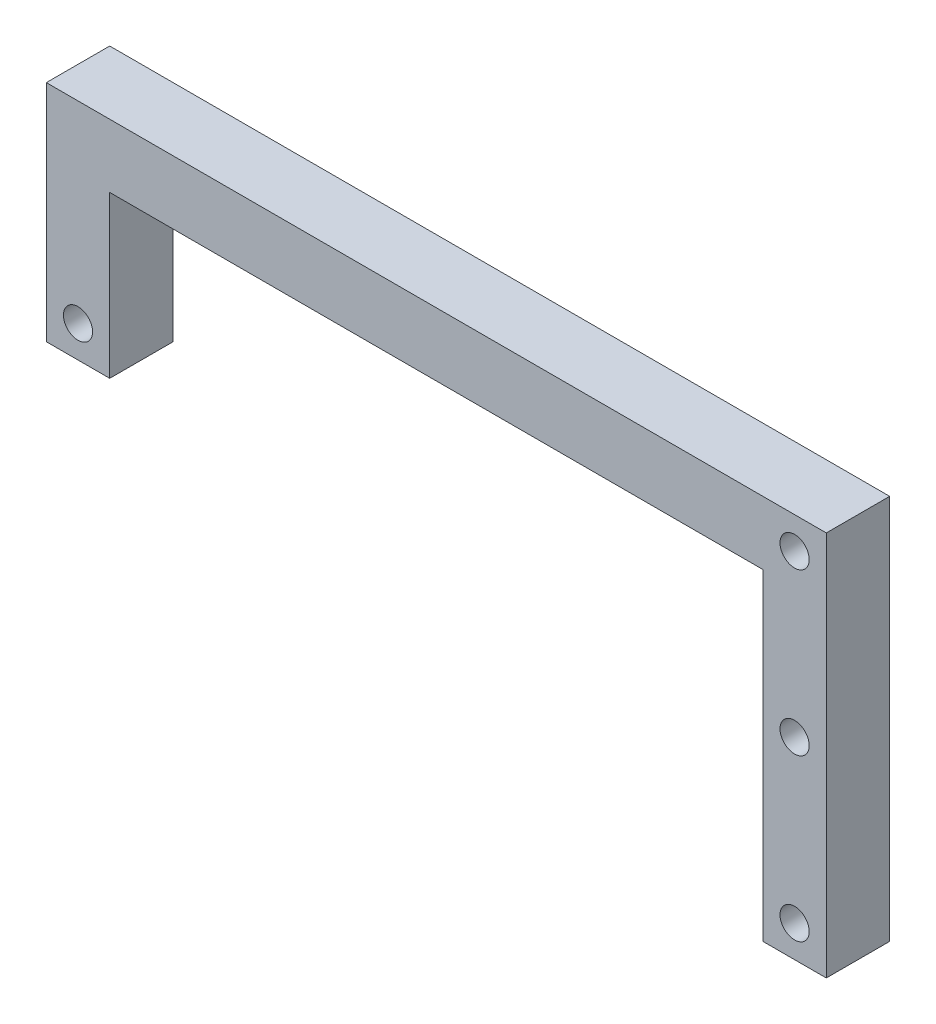
ISO-10303-21;
HEADER;
FILE_DESCRIPTION(('STEP AP214'),'2;1');
FILE_NAME('part.step','',(''),(''),'','','');
FILE_SCHEMA(('AUTOMOTIVE_DESIGN { 1 0 10303 214 1 1 1 1 }'));
ENDSEC;
DATA;
#1=APPLICATION_CONTEXT('core data for automotive mechanical design processes');
#2=APPLICATION_PROTOCOL_DEFINITION('international standard','automotive_design',2000,#1);
#3=PRODUCT_CONTEXT('',#1,'mechanical');
#4=PRODUCT('Part','Part','',(#3));
#5=PRODUCT_RELATED_PRODUCT_CATEGORY('part','',(#4));
#6=PRODUCT_DEFINITION_FORMATION('','',#4);
#7=PRODUCT_DEFINITION_CONTEXT('part definition',#1,'design');
#8=PRODUCT_DEFINITION('design','',#6,#7);
#9=PRODUCT_DEFINITION_SHAPE('','',#8);
#10=(LENGTH_UNIT() NAMED_UNIT(*) SI_UNIT(.MILLI.,.METRE.));
#11=(NAMED_UNIT(*) PLANE_ANGLE_UNIT() SI_UNIT($,.RADIAN.));
#12=(NAMED_UNIT(*) SI_UNIT($,.STERADIAN.) SOLID_ANGLE_UNIT());
#13=UNCERTAINTY_MEASURE_WITH_UNIT(LENGTH_MEASURE(1.E-05),#10,'distance_accuracy_value','');
#14=(GEOMETRIC_REPRESENTATION_CONTEXT(3) GLOBAL_UNCERTAINTY_ASSIGNED_CONTEXT((#13)) GLOBAL_UNIT_ASSIGNED_CONTEXT((#10,
#11,#12)) REPRESENTATION_CONTEXT('',''));
#15=CARTESIAN_POINT('',(0.,0.,0.));
#16=DIRECTION('',(0.,0.,1.));
#17=DIRECTION('',(1.,0.,0.));
#18=AXIS2_PLACEMENT_3D('',#15,#16,#17);
#19=CARTESIAN_POINT('',(0.,0.,10.));
#20=DIRECTION('',(0.,0.,1.));
#21=DIRECTION('',(1.,0.,0.));
#22=AXIS2_PLACEMENT_3D('',#19,#20,#21);
#23=PLANE('',#22);
#24=CARTESIAN_POINT('',(113.03,-25.4,10.));
#25=DIRECTION('',(0.,0.,1.));
#26=DIRECTION('',(1.,0.,0.));
#27=AXIS2_PLACEMENT_3D('',#24,#25,#26);
#28=CIRCLE('',#27,2.29999999999999);
#29=CARTESIAN_POINT('',(115.33,-25.4,10.));
#30=VERTEX_POINT('',#29);
#31=EDGE_CURVE('E221',#30,#30,#28,.T.);
#32=ORIENTED_EDGE('',*,*,#31,.F.);
#33=EDGE_LOOP('',(#32));
#34=FACE_BOUND('',#33,.T.);
#35=CARTESIAN_POINT('',(0.,0.,10.));
#36=DIRECTION('',(0.,0.,1.));
#37=DIRECTION('',(1.,0.,0.));
#38=AXIS2_PLACEMENT_3D('',#35,#36,#37);
#39=CIRCLE('',#38,2.3);
#40=CARTESIAN_POINT('',(2.3,0.,10.));
#41=VERTEX_POINT('',#40);
#42=EDGE_CURVE('E146',#41,#41,#39,.T.);
#43=ORIENTED_EDGE('',*,*,#42,.F.);
#44=EDGE_LOOP('',(#43));
#45=FACE_BOUND('',#44,.T.);
#46=DIRECTION('',(0.,-1.,0.));
#47=VECTOR('',#46,1.);
#48=CARTESIAN_POINT('',(108.03,20.4,10.));
#49=LINE('',#48,#47);
#50=CARTESIAN_POINT('',(108.03,20.4,10.));
#51=VERTEX_POINT('',#50);
#52=CARTESIAN_POINT('',(108.03,-30.4,10.));
#53=VERTEX_POINT('',#52);
#54=EDGE_CURVE('E164',#51,#53,#49,.T.);
#55=ORIENTED_EDGE('',*,*,#54,.T.);
#56=DIRECTION('',(1.,0.,0.));
#57=VECTOR('',#56,1.);
#58=CARTESIAN_POINT('',(108.03,-30.4,10.));
#59=LINE('',#58,#57);
#60=CARTESIAN_POINT('',(118.03,-30.4,10.));
#61=VERTEX_POINT('',#60);
#62=EDGE_CURVE('E100',#53,#61,#59,.T.);
#63=ORIENTED_EDGE('',*,*,#62,.T.);
#64=DIRECTION('',(0.,1.,0.));
#65=VECTOR('',#64,1.);
#66=CARTESIAN_POINT('',(118.03,-30.4,10.));
#67=LINE('',#66,#65);
#68=CARTESIAN_POINT('',(118.03,30.4,10.));
#69=VERTEX_POINT('',#68);
#70=EDGE_CURVE('E185',#61,#69,#67,.T.);
#71=ORIENTED_EDGE('',*,*,#70,.T.);
#72=DIRECTION('',(-1.,0.,0.));
#73=VECTOR('',#72,1.);
#74=CARTESIAN_POINT('',(118.03,30.4,10.));
#75=LINE('',#74,#73);
#76=CARTESIAN_POINT('',(-5.00000000000001,30.4,10.));
#77=VERTEX_POINT('',#76);
#78=EDGE_CURVE('E199',#69,#77,#75,.T.);
#79=ORIENTED_EDGE('',*,*,#78,.T.);
#80=DIRECTION('',(0.,-1.,0.));
#81=VECTOR('',#80,1.);
#82=CARTESIAN_POINT('',(-5.00000000000001,30.4,10.));
#83=LINE('',#82,#81);
#84=CARTESIAN_POINT('',(-5.,-5.,10.));
#85=VERTEX_POINT('',#84);
#86=EDGE_CURVE('E119',#77,#85,#83,.T.);
#87=ORIENTED_EDGE('',*,*,#86,.T.);
#88=DIRECTION('',(1.,0.,0.));
#89=VECTOR('',#88,1.);
#90=CARTESIAN_POINT('',(-5.,-5.,10.));
#91=LINE('',#90,#89);
#92=CARTESIAN_POINT('',(5.,-5.,10.));
#93=VERTEX_POINT('',#92);
#94=EDGE_CURVE('E113',#85,#93,#91,.T.);
#95=ORIENTED_EDGE('',*,*,#94,.T.);
#96=DIRECTION('',(0.,1.,0.));
#97=VECTOR('',#96,1.);
#98=CARTESIAN_POINT('',(5.,-5.,10.));
#99=LINE('',#98,#97);
#100=CARTESIAN_POINT('',(5.,20.4,10.));
#101=VERTEX_POINT('',#100);
#102=EDGE_CURVE('E117',#93,#101,#99,.T.);
#103=ORIENTED_EDGE('',*,*,#102,.T.);
#104=DIRECTION('',(1.,0.,0.));
#105=VECTOR('',#104,1.);
#106=CARTESIAN_POINT('',(5.,20.4,10.));
#107=LINE('',#106,#105);
#108=EDGE_CURVE('E57',#101,#51,#107,.T.);
#109=ORIENTED_EDGE('',*,*,#108,.T.);
#110=EDGE_LOOP('',(#55,#63,#71,#79,#87,#95,#103,#109));
#111=FACE_BOUND('',#110,.T.);
#112=CARTESIAN_POINT('',(113.03,0.,10.));
#113=DIRECTION('',(0.,0.,1.));
#114=DIRECTION('',(1.,0.,0.));
#115=AXIS2_PLACEMENT_3D('',#112,#113,#114);
#116=CIRCLE('',#115,2.29999999999999);
#117=CARTESIAN_POINT('',(115.33,0.,10.));
#118=VERTEX_POINT('',#117);
#119=EDGE_CURVE('E213',#118,#118,#116,.T.);
#120=ORIENTED_EDGE('',*,*,#119,.F.);
#121=EDGE_LOOP('',(#120));
#122=FACE_BOUND('',#121,.T.);
#123=CARTESIAN_POINT('',(113.03,25.4,10.));
#124=DIRECTION('',(0.,0.,1.));
#125=DIRECTION('',(1.,0.,0.));
#126=AXIS2_PLACEMENT_3D('',#123,#124,#125);
#127=CIRCLE('',#126,2.29999999999999);
#128=CARTESIAN_POINT('',(115.33,25.4,10.));
#129=VERTEX_POINT('',#128);
#130=EDGE_CURVE('E229',#129,#129,#127,.T.);
#131=ORIENTED_EDGE('',*,*,#130,.F.);
#132=EDGE_LOOP('',(#131));
#133=FACE_BOUND('',#132,.T.);
#134=ADVANCED_FACE('F39',(#34,#45,#111,#122,#133),#23,.T.);
#135=CARTESIAN_POINT('',(0.,0.,0.));
#136=DIRECTION('',(0.,0.,1.));
#137=DIRECTION('',(1.,0.,0.));
#138=AXIS2_PLACEMENT_3D('',#135,#136,#137);
#139=PLANE('',#138);
#140=DIRECTION('',(0.,-1.,0.));
#141=VECTOR('',#140,1.);
#142=CARTESIAN_POINT('',(108.03,20.4,0.));
#143=LINE('',#142,#141);
#144=CARTESIAN_POINT('',(108.03,20.4,0.));
#145=VERTEX_POINT('',#144);
#146=CARTESIAN_POINT('',(108.03,-30.4,0.));
#147=VERTEX_POINT('',#146);
#148=EDGE_CURVE('E141',#145,#147,#143,.T.);
#149=ORIENTED_EDGE('',*,*,#148,.F.);
#150=DIRECTION('',(1.,0.,0.));
#151=VECTOR('',#150,1.);
#152=CARTESIAN_POINT('',(5.,20.4,0.));
#153=LINE('',#152,#151);
#154=CARTESIAN_POINT('',(5.,20.4,0.));
#155=VERTEX_POINT('',#154);
#156=EDGE_CURVE('E92',#155,#145,#153,.T.);
#157=ORIENTED_EDGE('',*,*,#156,.F.);
#158=DIRECTION('',(0.,1.,0.));
#159=VECTOR('',#158,1.);
#160=CARTESIAN_POINT('',(5.,-5.,0.));
#161=LINE('',#160,#159);
#162=CARTESIAN_POINT('',(5.,-5.,0.));
#163=VERTEX_POINT('',#162);
#164=EDGE_CURVE('E86',#163,#155,#161,.T.);
#165=ORIENTED_EDGE('',*,*,#164,.F.);
#166=DIRECTION('',(1.,0.,0.));
#167=VECTOR('',#166,1.);
#168=CARTESIAN_POINT('',(-5.,-5.,0.));
#169=LINE('',#168,#167);
#170=CARTESIAN_POINT('',(-5.,-5.,0.));
#171=VERTEX_POINT('',#170);
#172=EDGE_CURVE('E128',#171,#163,#169,.T.);
#173=ORIENTED_EDGE('',*,*,#172,.F.);
#174=DIRECTION('',(0.,-1.,0.));
#175=VECTOR('',#174,1.);
#176=CARTESIAN_POINT('',(-5.00000000000001,30.4,0.));
#177=LINE('',#176,#175);
#178=CARTESIAN_POINT('',(-5.00000000000001,30.4,0.));
#179=VERTEX_POINT('',#178);
#180=EDGE_CURVE('E155',#179,#171,#177,.T.);
#181=ORIENTED_EDGE('',*,*,#180,.F.);
#182=DIRECTION('',(-1.,0.,0.));
#183=VECTOR('',#182,1.);
#184=CARTESIAN_POINT('',(118.03,30.4,0.));
#185=LINE('',#184,#183);
#186=CARTESIAN_POINT('',(118.03,30.4,0.));
#187=VERTEX_POINT('',#186);
#188=EDGE_CURVE('E152',#187,#179,#185,.T.);
#189=ORIENTED_EDGE('',*,*,#188,.F.);
#190=DIRECTION('',(0.,1.,0.));
#191=VECTOR('',#190,1.);
#192=CARTESIAN_POINT('',(118.03,-30.4,0.));
#193=LINE('',#192,#191);
#194=CARTESIAN_POINT('',(118.03,-30.4,0.));
#195=VERTEX_POINT('',#194);
#196=EDGE_CURVE('E149',#195,#187,#193,.T.);
#197=ORIENTED_EDGE('',*,*,#196,.F.);
#198=DIRECTION('',(1.,0.,0.));
#199=VECTOR('',#198,1.);
#200=CARTESIAN_POINT('',(108.03,-30.4,0.));
#201=LINE('',#200,#199);
#202=EDGE_CURVE('E145',#147,#195,#201,.T.);
#203=ORIENTED_EDGE('',*,*,#202,.F.);
#204=EDGE_LOOP('',(#149,#157,#165,#173,#181,#189,#197,#203));
#205=FACE_BOUND('',#204,.T.);
#206=CARTESIAN_POINT('',(0.,0.,0.));
#207=DIRECTION('',(0.,0.,1.));
#208=DIRECTION('',(1.,0.,0.));
#209=AXIS2_PLACEMENT_3D('',#206,#207,#208);
#210=CIRCLE('',#209,2.3);
#211=CARTESIAN_POINT('',(2.3,0.,0.));
#212=VERTEX_POINT('',#211);
#213=EDGE_CURVE('E209',#212,#212,#210,.T.);
#214=ORIENTED_EDGE('',*,*,#213,.T.);
#215=EDGE_LOOP('',(#214));
#216=FACE_BOUND('',#215,.T.);
#217=CARTESIAN_POINT('',(113.03,0.,0.));
#218=DIRECTION('',(0.,0.,1.));
#219=DIRECTION('',(1.,0.,0.));
#220=AXIS2_PLACEMENT_3D('',#217,#218,#219);
#221=CIRCLE('',#220,2.29999999999999);
#222=CARTESIAN_POINT('',(115.33,0.,0.));
#223=VERTEX_POINT('',#222);
#224=EDGE_CURVE('E217',#223,#223,#221,.T.);
#225=ORIENTED_EDGE('',*,*,#224,.T.);
#226=EDGE_LOOP('',(#225));
#227=FACE_BOUND('',#226,.T.);
#228=CARTESIAN_POINT('',(113.03,-25.4,0.));
#229=DIRECTION('',(0.,0.,1.));
#230=DIRECTION('',(1.,0.,0.));
#231=AXIS2_PLACEMENT_3D('',#228,#229,#230);
#232=CIRCLE('',#231,2.29999999999999);
#233=CARTESIAN_POINT('',(115.33,-25.4,0.));
#234=VERTEX_POINT('',#233);
#235=EDGE_CURVE('E225',#234,#234,#232,.T.);
#236=ORIENTED_EDGE('',*,*,#235,.T.);
#237=EDGE_LOOP('',(#236));
#238=FACE_BOUND('',#237,.T.);
#239=CARTESIAN_POINT('',(113.03,25.4,0.));
#240=DIRECTION('',(0.,0.,1.));
#241=DIRECTION('',(1.,0.,0.));
#242=AXIS2_PLACEMENT_3D('',#239,#240,#241);
#243=CIRCLE('',#242,2.29999999999999);
#244=CARTESIAN_POINT('',(115.33,25.4,0.));
#245=VERTEX_POINT('',#244);
#246=EDGE_CURVE('E233',#245,#245,#243,.T.);
#247=ORIENTED_EDGE('',*,*,#246,.T.);
#248=EDGE_LOOP('',(#247));
#249=FACE_BOUND('',#248,.T.);
#250=ADVANCED_FACE('F189',(#205,#216,#227,#238,#249),#139,.F.);
#251=CARTESIAN_POINT('',(108.03,20.4,10.));
#252=DIRECTION('',(1.,0.,0.));
#253=DIRECTION('',(0.,0.,-1.));
#254=AXIS2_PLACEMENT_3D('',#251,#252,#253);
#255=PLANE('',#254);
#256=ORIENTED_EDGE('',*,*,#148,.T.);
#257=DIRECTION('',(0.,0.,-1.));
#258=VECTOR('',#257,1.);
#259=CARTESIAN_POINT('',(108.03,-30.4,10.));
#260=LINE('',#259,#258);
#261=EDGE_CURVE('E11',#53,#147,#260,.T.);
#262=ORIENTED_EDGE('',*,*,#261,.F.);
#263=ORIENTED_EDGE('',*,*,#54,.F.);
#264=DIRECTION('',(0.,0.,-1.));
#265=VECTOR('',#264,1.);
#266=CARTESIAN_POINT('',(108.03,20.4,10.));
#267=LINE('',#266,#265);
#268=EDGE_CURVE('E137',#51,#145,#267,.T.);
#269=ORIENTED_EDGE('',*,*,#268,.T.);
#270=EDGE_LOOP('',(#256,#262,#263,#269));
#271=FACE_BOUND('',#270,.T.);
#272=ADVANCED_FACE('F41',(#271),#255,.F.);
#273=CARTESIAN_POINT('',(108.03,-30.4,10.));
#274=DIRECTION('',(0.,1.,0.));
#275=DIRECTION('',(0.,0.,1.));
#276=AXIS2_PLACEMENT_3D('',#273,#274,#275);
#277=PLANE('',#276);
#278=ORIENTED_EDGE('',*,*,#202,.T.);
#279=DIRECTION('',(0.,0.,-1.));
#280=VECTOR('',#279,1.);
#281=CARTESIAN_POINT('',(118.03,-30.4,10.));
#282=LINE('',#281,#280);
#283=EDGE_CURVE('E49',#61,#195,#282,.T.);
#284=ORIENTED_EDGE('',*,*,#283,.F.);
#285=ORIENTED_EDGE('',*,*,#62,.F.);
#286=ORIENTED_EDGE('',*,*,#261,.T.);
#287=EDGE_LOOP('',(#278,#284,#285,#286));
#288=FACE_BOUND('',#287,.T.);
#289=ADVANCED_FACE('F269',(#288),#277,.F.);
#290=CARTESIAN_POINT('',(118.03,-30.4,10.));
#291=DIRECTION('',(-1.,0.,0.));
#292=DIRECTION('',(0.,0.,1.));
#293=AXIS2_PLACEMENT_3D('',#290,#291,#292);
#294=PLANE('',#293);
#295=ORIENTED_EDGE('',*,*,#196,.T.);
#296=DIRECTION('',(0.,0.,-1.));
#297=VECTOR('',#296,1.);
#298=CARTESIAN_POINT('',(118.03,30.4,10.));
#299=LINE('',#298,#297);
#300=EDGE_CURVE('E175',#69,#187,#299,.T.);
#301=ORIENTED_EDGE('',*,*,#300,.F.);
#302=ORIENTED_EDGE('',*,*,#70,.F.);
#303=ORIENTED_EDGE('',*,*,#283,.T.);
#304=EDGE_LOOP('',(#295,#301,#302,#303));
#305=FACE_BOUND('',#304,.T.);
#306=ADVANCED_FACE('F183',(#305),#294,.F.);
#307=CARTESIAN_POINT('',(118.03,30.4,10.));
#308=DIRECTION('',(0.,-1.,0.));
#309=DIRECTION('',(1.,0.,0.));
#310=AXIS2_PLACEMENT_3D('',#307,#308,#309);
#311=PLANE('',#310);
#312=ORIENTED_EDGE('',*,*,#188,.T.);
#313=DIRECTION('',(0.,0.,-1.));
#314=VECTOR('',#313,1.);
#315=CARTESIAN_POINT('',(-5.00000000000001,30.4,10.));
#316=LINE('',#315,#314);
#317=EDGE_CURVE('E171',#77,#179,#316,.T.);
#318=ORIENTED_EDGE('',*,*,#317,.F.);
#319=ORIENTED_EDGE('',*,*,#78,.F.);
#320=ORIENTED_EDGE('',*,*,#300,.T.);
#321=EDGE_LOOP('',(#312,#318,#319,#320));
#322=FACE_BOUND('',#321,.T.);
#323=ADVANCED_FACE('F194',(#322),#311,.F.);
#324=CARTESIAN_POINT('',(-5.00000000000001,30.4,10.));
#325=DIRECTION('',(1.,0.,0.));
#326=DIRECTION('',(0.,1.,0.));
#327=AXIS2_PLACEMENT_3D('',#324,#325,#326);
#328=PLANE('',#327);
#329=ORIENTED_EDGE('',*,*,#180,.T.);
#330=DIRECTION('',(0.,0.,-1.));
#331=VECTOR('',#330,1.);
#332=CARTESIAN_POINT('',(-5.,-5.,10.));
#333=LINE('',#332,#331);
#334=EDGE_CURVE('E130',#85,#171,#333,.T.);
#335=ORIENTED_EDGE('',*,*,#334,.F.);
#336=ORIENTED_EDGE('',*,*,#86,.F.);
#337=ORIENTED_EDGE('',*,*,#317,.T.);
#338=EDGE_LOOP('',(#329,#335,#336,#337));
#339=FACE_BOUND('',#338,.T.);
#340=ADVANCED_FACE('F197',(#339),#328,.F.);
#341=CARTESIAN_POINT('',(-5.,-5.,10.));
#342=DIRECTION('',(0.,1.,0.));
#343=DIRECTION('',(0.,0.,1.));
#344=AXIS2_PLACEMENT_3D('',#341,#342,#343);
#345=PLANE('',#344);
#346=ORIENTED_EDGE('',*,*,#172,.T.);
#347=DIRECTION('',(0.,0.,-1.));
#348=VECTOR('',#347,1.);
#349=CARTESIAN_POINT('',(5.,-5.,10.));
#350=LINE('',#349,#348);
#351=EDGE_CURVE('E125',#93,#163,#350,.T.);
#352=ORIENTED_EDGE('',*,*,#351,.F.);
#353=ORIENTED_EDGE('',*,*,#94,.F.);
#354=ORIENTED_EDGE('',*,*,#334,.T.);
#355=EDGE_LOOP('',(#346,#352,#353,#354));
#356=FACE_BOUND('',#355,.T.);
#357=ADVANCED_FACE('F126',(#356),#345,.F.);
#358=CARTESIAN_POINT('',(5.,-5.,10.));
#359=DIRECTION('',(-1.,0.,0.));
#360=DIRECTION('',(0.,-1.,0.));
#361=AXIS2_PLACEMENT_3D('',#358,#359,#360);
#362=PLANE('',#361);
#363=ORIENTED_EDGE('',*,*,#164,.T.);
#364=DIRECTION('',(0.,0.,-1.));
#365=VECTOR('',#364,1.);
#366=CARTESIAN_POINT('',(5.,20.4,10.));
#367=LINE('',#366,#365);
#368=EDGE_CURVE('E131',#101,#155,#367,.T.);
#369=ORIENTED_EDGE('',*,*,#368,.F.);
#370=ORIENTED_EDGE('',*,*,#102,.F.);
#371=ORIENTED_EDGE('',*,*,#351,.T.);
#372=EDGE_LOOP('',(#363,#369,#370,#371));
#373=FACE_BOUND('',#372,.T.);
#374=ADVANCED_FACE('F133',(#373),#362,.F.);
#375=CARTESIAN_POINT('',(5.,20.4,10.));
#376=DIRECTION('',(0.,1.,0.));
#377=DIRECTION('',(0.,0.,1.));
#378=AXIS2_PLACEMENT_3D('',#375,#376,#377);
#379=PLANE('',#378);
#380=ORIENTED_EDGE('',*,*,#156,.T.);
#381=ORIENTED_EDGE('',*,*,#268,.F.);
#382=ORIENTED_EDGE('',*,*,#108,.F.);
#383=ORIENTED_EDGE('',*,*,#368,.T.);
#384=EDGE_LOOP('',(#380,#381,#382,#383));
#385=FACE_BOUND('',#384,.T.);
#386=ADVANCED_FACE('F257',(#385),#379,.F.);
#387=CARTESIAN_POINT('',(0.,0.,10.));
#388=DIRECTION('',(0.,0.,-1.));
#389=DIRECTION('',(-1.,0.,0.));
#390=AXIS2_PLACEMENT_3D('',#387,#388,#389);
#391=CYLINDRICAL_SURFACE('',#390,2.3);
#392=ORIENTED_EDGE('',*,*,#42,.T.);
#393=EDGE_LOOP('',(#392));
#394=FACE_BOUND('',#393,.T.);
#395=ORIENTED_EDGE('',*,*,#213,.F.);
#396=EDGE_LOOP('',(#395));
#397=FACE_BOUND('',#396,.T.);
#398=ADVANCED_FACE('F254',(#394,#397),#391,.F.);
#399=CARTESIAN_POINT('',(113.03,0.,10.));
#400=DIRECTION('',(0.,0.,-1.));
#401=DIRECTION('',(-1.,0.,0.));
#402=AXIS2_PLACEMENT_3D('',#399,#400,#401);
#403=CYLINDRICAL_SURFACE('',#402,2.29999999999999);
#404=ORIENTED_EDGE('',*,*,#119,.T.);
#405=EDGE_LOOP('',(#404));
#406=FACE_BOUND('',#405,.T.);
#407=ORIENTED_EDGE('',*,*,#224,.F.);
#408=EDGE_LOOP('',(#407));
#409=FACE_BOUND('',#408,.T.);
#410=ADVANCED_FACE('F333',(#406,#409),#403,.F.);
#411=CARTESIAN_POINT('',(113.03,-25.4,10.));
#412=DIRECTION('',(0.,0.,-1.));
#413=DIRECTION('',(-1.,0.,0.));
#414=AXIS2_PLACEMENT_3D('',#411,#412,#413);
#415=CYLINDRICAL_SURFACE('',#414,2.29999999999999);
#416=ORIENTED_EDGE('',*,*,#31,.T.);
#417=EDGE_LOOP('',(#416));
#418=FACE_BOUND('',#417,.T.);
#419=ORIENTED_EDGE('',*,*,#235,.F.);
#420=EDGE_LOOP('',(#419));
#421=FACE_BOUND('',#420,.T.);
#422=ADVANCED_FACE('F341',(#418,#421),#415,.F.);
#423=CARTESIAN_POINT('',(113.03,25.4,10.));
#424=DIRECTION('',(0.,0.,-1.));
#425=DIRECTION('',(-1.,0.,0.));
#426=AXIS2_PLACEMENT_3D('',#423,#424,#425);
#427=CYLINDRICAL_SURFACE('',#426,2.29999999999999);
#428=ORIENTED_EDGE('',*,*,#130,.T.);
#429=EDGE_LOOP('',(#428));
#430=FACE_BOUND('',#429,.T.);
#431=ORIENTED_EDGE('',*,*,#246,.F.);
#432=EDGE_LOOP('',(#431));
#433=FACE_BOUND('',#432,.T.);
#434=ADVANCED_FACE('F241',(#430,#433),#427,.F.);
#435=CLOSED_SHELL('',(#134,#250,#272,#289,#306,#323,#340,#357,#374,#386,#398,#410,#422,#434));
#436=MANIFOLD_SOLID_BREP('B2',#435);
#437=ADVANCED_BREP_SHAPE_REPRESENTATION('',(#18,#436),#14);
#438=SHAPE_DEFINITION_REPRESENTATION(#9,#437);
ENDSEC;
END-ISO-10303-21;
